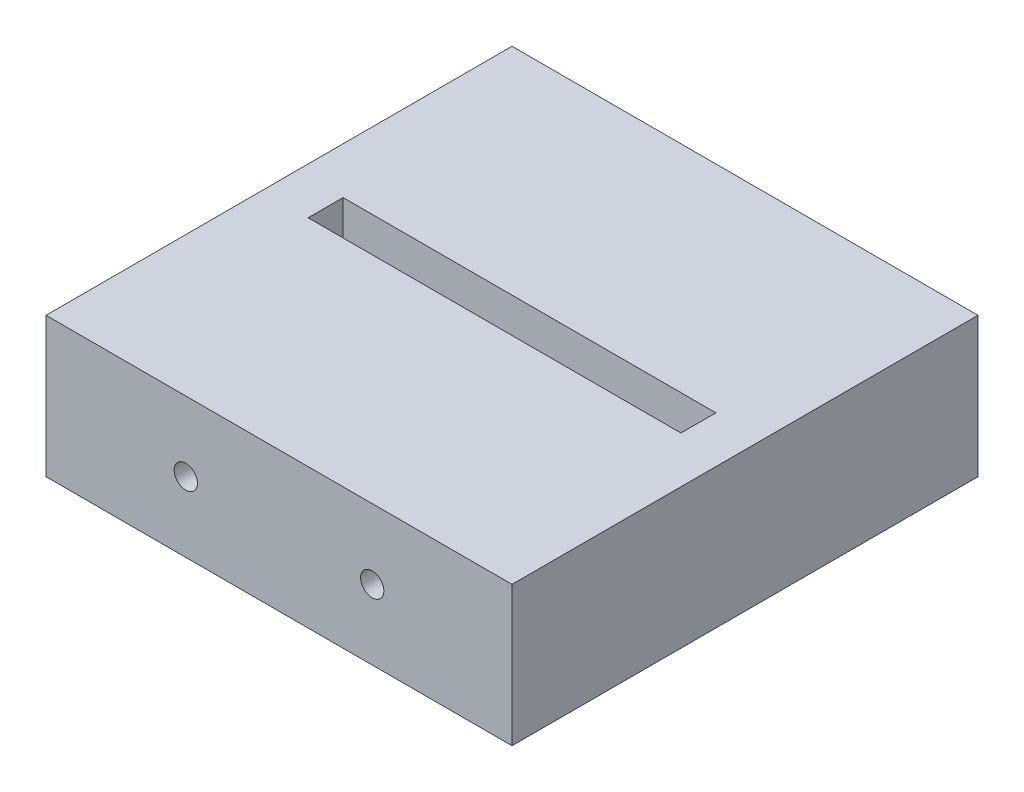
ISO-10303-21;
HEADER;
FILE_DESCRIPTION(('STEP AP214'),'2;1');
FILE_NAME('part.step','',(''),(''),'','','');
FILE_SCHEMA(('AUTOMOTIVE_DESIGN { 1 0 10303 214 1 1 1 1 }'));
ENDSEC;
DATA;
#1=APPLICATION_CONTEXT('core data for automotive mechanical design processes');
#2=APPLICATION_PROTOCOL_DEFINITION('international standard','automotive_design',2000,#1);
#3=PRODUCT_CONTEXT('',#1,'mechanical');
#4=PRODUCT('Part','Part','',(#3));
#5=PRODUCT_RELATED_PRODUCT_CATEGORY('part','',(#4));
#6=PRODUCT_DEFINITION_FORMATION('','',#4);
#7=PRODUCT_DEFINITION_CONTEXT('part definition',#1,'design');
#8=PRODUCT_DEFINITION('design','',#6,#7);
#9=PRODUCT_DEFINITION_SHAPE('','',#8);
#10=(LENGTH_UNIT() NAMED_UNIT(*) SI_UNIT(.MILLI.,.METRE.));
#11=(NAMED_UNIT(*) PLANE_ANGLE_UNIT() SI_UNIT($,.RADIAN.));
#12=(NAMED_UNIT(*) SI_UNIT($,.STERADIAN.) SOLID_ANGLE_UNIT());
#13=UNCERTAINTY_MEASURE_WITH_UNIT(LENGTH_MEASURE(1.E-05),#10,'distance_accuracy_value','');
#14=(GEOMETRIC_REPRESENTATION_CONTEXT(3) GLOBAL_UNCERTAINTY_ASSIGNED_CONTEXT((#13)) GLOBAL_UNIT_ASSIGNED_CONTEXT((#10,
#11,#12)) REPRESENTATION_CONTEXT('',''));
#15=CARTESIAN_POINT('',(0.,0.,0.));
#16=DIRECTION('',(0.,0.,1.));
#17=DIRECTION('',(1.,0.,0.));
#18=AXIS2_PLACEMENT_3D('',#15,#16,#17);
#19=CARTESIAN_POINT('',(63.5,38.1,63.5));
#20=DIRECTION('',(0.,0.,-1.));
#21=DIRECTION('',(-1.,0.,0.));
#22=AXIS2_PLACEMENT_3D('',#19,#20,#21);
#23=PLANE('',#22);
#24=DIRECTION('',(1.,0.,0.));
#25=VECTOR('',#24,1.);
#26=CARTESIAN_POINT('',(63.5,0.,63.5));
#27=LINE('',#26,#25);
#28=CARTESIAN_POINT('',(-63.5,0.,63.5));
#29=VERTEX_POINT('',#28);
#30=CARTESIAN_POINT('',(63.5,0.,63.5));
#31=VERTEX_POINT('',#30);
#32=EDGE_CURVE('E154',#29,#31,#27,.T.);
#33=ORIENTED_EDGE('',*,*,#32,.T.);
#34=DIRECTION('',(0.,-1.,0.));
#35=VECTOR('',#34,1.);
#36=CARTESIAN_POINT('',(63.5,38.1,63.5));
#37=LINE('',#36,#35);
#38=CARTESIAN_POINT('',(63.5,38.1,63.5));
#39=VERTEX_POINT('',#38);
#40=EDGE_CURVE('E42',#39,#31,#37,.T.);
#41=ORIENTED_EDGE('',*,*,#40,.F.);
#42=DIRECTION('',(1.,0.,0.));
#43=VECTOR('',#42,1.);
#44=CARTESIAN_POINT('',(63.5,38.1,63.5));
#45=LINE('',#44,#43);
#46=CARTESIAN_POINT('',(-63.5,38.1,63.5));
#47=VERTEX_POINT('',#46);
#48=EDGE_CURVE('E144',#47,#39,#45,.T.);
#49=ORIENTED_EDGE('',*,*,#48,.F.);
#50=DIRECTION('',(0.,-1.,0.));
#51=VECTOR('',#50,1.);
#52=CARTESIAN_POINT('',(-63.5,38.1,63.5));
#53=LINE('',#52,#51);
#54=EDGE_CURVE('E11',#47,#29,#53,.T.);
#55=ORIENTED_EDGE('',*,*,#54,.T.);
#56=EDGE_LOOP('',(#33,#41,#49,#55));
#57=FACE_BOUND('',#56,.T.);
#58=CARTESIAN_POINT('',(-25.4,19.05,63.5));
#59=DIRECTION('',(0.,0.,1.));
#60=DIRECTION('',(1.,0.,0.));
#61=AXIS2_PLACEMENT_3D('',#58,#59,#60);
#62=CIRCLE('',#61,3.175);
#63=CARTESIAN_POINT('',(-22.225,19.05,63.5));
#64=VERTEX_POINT('',#63);
#65=EDGE_CURVE('E171',#64,#64,#62,.T.);
#66=ORIENTED_EDGE('',*,*,#65,.F.);
#67=EDGE_LOOP('',(#66));
#68=FACE_BOUND('',#67,.T.);
#69=CARTESIAN_POINT('',(25.4,19.05,63.5));
#70=DIRECTION('',(0.,0.,-1.));
#71=DIRECTION('',(-1.,0.,0.));
#72=AXIS2_PLACEMENT_3D('',#69,#70,#71);
#73=CIRCLE('',#72,3.175);
#74=CARTESIAN_POINT('',(22.225,19.05,63.5));
#75=VERTEX_POINT('',#74);
#76=EDGE_CURVE('E183',#75,#75,#73,.T.);
#77=ORIENTED_EDGE('',*,*,#76,.T.);
#78=EDGE_LOOP('',(#77));
#79=FACE_BOUND('',#78,.T.);
#80=ADVANCED_FACE('F33',(#57,#68,#79),#23,.F.);
#81=CARTESIAN_POINT('',(63.5,38.1,-63.5));
#82=DIRECTION('',(0.,0.,1.));
#83=DIRECTION('',(1.,0.,0.));
#84=AXIS2_PLACEMENT_3D('',#81,#82,#83);
#85=PLANE('',#84);
#86=DIRECTION('',(-1.,0.,0.));
#87=VECTOR('',#86,1.);
#88=CARTESIAN_POINT('',(63.5,0.,-63.5));
#89=LINE('',#88,#87);
#90=CARTESIAN_POINT('',(63.5,0.,-63.5));
#91=VERTEX_POINT('',#90);
#92=CARTESIAN_POINT('',(-63.5,0.,-63.5));
#93=VERTEX_POINT('',#92);
#94=EDGE_CURVE('E145',#91,#93,#89,.T.);
#95=ORIENTED_EDGE('',*,*,#94,.T.);
#96=DIRECTION('',(0.,-1.,0.));
#97=VECTOR('',#96,1.);
#98=CARTESIAN_POINT('',(-63.5,38.1,-63.5));
#99=LINE('',#98,#97);
#100=CARTESIAN_POINT('',(-63.5,38.1,-63.5));
#101=VERTEX_POINT('',#100);
#102=EDGE_CURVE('E151',#101,#93,#99,.T.);
#103=ORIENTED_EDGE('',*,*,#102,.F.);
#104=DIRECTION('',(-1.,0.,0.));
#105=VECTOR('',#104,1.);
#106=CARTESIAN_POINT('',(63.5,38.1,-63.5));
#107=LINE('',#106,#105);
#108=CARTESIAN_POINT('',(63.5,38.1,-63.5));
#109=VERTEX_POINT('',#108);
#110=EDGE_CURVE('E149',#109,#101,#107,.T.);
#111=ORIENTED_EDGE('',*,*,#110,.F.);
#112=DIRECTION('',(0.,-1.,0.));
#113=VECTOR('',#112,1.);
#114=CARTESIAN_POINT('',(63.5,38.1,-63.5));
#115=LINE('',#114,#113);
#116=EDGE_CURVE('E161',#109,#91,#115,.T.);
#117=ORIENTED_EDGE('',*,*,#116,.T.);
#118=EDGE_LOOP('',(#95,#103,#111,#117));
#119=FACE_BOUND('',#118,.T.);
#120=CARTESIAN_POINT('',(-25.4,19.05,-63.5));
#121=DIRECTION('',(0.,0.,1.));
#122=DIRECTION('',(1.,0.,0.));
#123=AXIS2_PLACEMENT_3D('',#120,#121,#122);
#124=CIRCLE('',#123,3.175);
#125=CARTESIAN_POINT('',(-22.225,19.05,-63.5));
#126=VERTEX_POINT('',#125);
#127=EDGE_CURVE('E167',#126,#126,#124,.T.);
#128=ORIENTED_EDGE('',*,*,#127,.T.);
#129=EDGE_LOOP('',(#128));
#130=FACE_BOUND('',#129,.T.);
#131=CARTESIAN_POINT('',(25.4,19.05,-63.5));
#132=DIRECTION('',(0.,0.,-1.));
#133=DIRECTION('',(-1.,0.,0.));
#134=AXIS2_PLACEMENT_3D('',#131,#132,#133);
#135=CIRCLE('',#134,3.175);
#136=CARTESIAN_POINT('',(22.225,19.05,-63.5));
#137=VERTEX_POINT('',#136);
#138=EDGE_CURVE('E180',#137,#137,#135,.T.);
#139=ORIENTED_EDGE('',*,*,#138,.F.);
#140=EDGE_LOOP('',(#139));
#141=FACE_BOUND('',#140,.T.);
#142=ADVANCED_FACE('F201',(#119,#130,#141),#85,.F.);
#143=CARTESIAN_POINT('',(50.8,38.1,4.7625));
#144=DIRECTION('',(0.,0.,1.));
#145=DIRECTION('',(1.,0.,0.));
#146=AXIS2_PLACEMENT_3D('',#143,#144,#145);
#147=PLANE('',#146);
#148=DIRECTION('',(-1.,0.,0.));
#149=VECTOR('',#148,1.);
#150=CARTESIAN_POINT('',(50.8,0.,4.7625));
#151=LINE('',#150,#149);
#152=CARTESIAN_POINT('',(50.8,0.,4.7625));
#153=VERTEX_POINT('',#152);
#154=CARTESIAN_POINT('',(-50.8,0.,4.7625));
#155=VERTEX_POINT('',#154);
#156=EDGE_CURVE('E119',#153,#155,#151,.T.);
#157=ORIENTED_EDGE('',*,*,#156,.T.);
#158=DIRECTION('',(0.,-1.,0.));
#159=VECTOR('',#158,1.);
#160=CARTESIAN_POINT('',(-50.8,38.1,4.7625));
#161=LINE('',#160,#159);
#162=CARTESIAN_POINT('',(-50.8,38.1,4.7625));
#163=VERTEX_POINT('',#162);
#164=EDGE_CURVE('E135',#163,#155,#161,.T.);
#165=ORIENTED_EDGE('',*,*,#164,.F.);
#166=DIRECTION('',(-1.,0.,0.));
#167=VECTOR('',#166,1.);
#168=CARTESIAN_POINT('',(50.8,38.1,4.7625));
#169=LINE('',#168,#167);
#170=CARTESIAN_POINT('',(50.8,38.1,4.7625));
#171=VERTEX_POINT('',#170);
#172=EDGE_CURVE('E108',#171,#163,#169,.T.);
#173=ORIENTED_EDGE('',*,*,#172,.F.);
#174=DIRECTION('',(0.,-1.,0.));
#175=VECTOR('',#174,1.);
#176=CARTESIAN_POINT('',(50.8,38.1,4.7625));
#177=LINE('',#176,#175);
#178=EDGE_CURVE('E138',#171,#153,#177,.T.);
#179=ORIENTED_EDGE('',*,*,#178,.T.);
#180=EDGE_LOOP('',(#157,#165,#173,#179));
#181=FACE_BOUND('',#180,.T.);
#182=CARTESIAN_POINT('',(-25.4,19.05,4.7625));
#183=DIRECTION('',(0.,0.,1.));
#184=DIRECTION('',(1.,0.,0.));
#185=AXIS2_PLACEMENT_3D('',#182,#183,#184);
#186=CIRCLE('',#185,3.175);
#187=CARTESIAN_POINT('',(-22.225,19.05,4.7625));
#188=VERTEX_POINT('',#187);
#189=EDGE_CURVE('E125',#188,#188,#186,.T.);
#190=ORIENTED_EDGE('',*,*,#189,.T.);
#191=EDGE_LOOP('',(#190));
#192=FACE_BOUND('',#191,.T.);
#193=CARTESIAN_POINT('',(25.4,19.05,4.7625));
#194=DIRECTION('',(0.,0.,1.));
#195=DIRECTION('',(1.,0.,0.));
#196=AXIS2_PLACEMENT_3D('',#193,#194,#195);
#197=CIRCLE('',#196,3.175);
#198=CARTESIAN_POINT('',(28.575,19.05,4.7625));
#199=VERTEX_POINT('',#198);
#200=EDGE_CURVE('E176',#199,#199,#197,.F.);
#201=ORIENTED_EDGE('',*,*,#200,.F.);
#202=EDGE_LOOP('',(#201));
#203=FACE_BOUND('',#202,.T.);
#204=ADVANCED_FACE('F193',(#181,#192,#203),#147,.F.);
#205=CARTESIAN_POINT('',(50.8,38.1,-4.7625));
#206=DIRECTION('',(0.,0.,-1.));
#207=DIRECTION('',(-1.,0.,0.));
#208=AXIS2_PLACEMENT_3D('',#205,#206,#207);
#209=PLANE('',#208);
#210=DIRECTION('',(1.,0.,0.));
#211=VECTOR('',#210,1.);
#212=CARTESIAN_POINT('',(50.8,0.,-4.7625));
#213=LINE('',#212,#211);
#214=CARTESIAN_POINT('',(-50.8,0.,-4.7625));
#215=VERTEX_POINT('',#214);
#216=CARTESIAN_POINT('',(50.8,0.,-4.7625));
#217=VERTEX_POINT('',#216);
#218=EDGE_CURVE('E131',#215,#217,#213,.T.);
#219=ORIENTED_EDGE('',*,*,#218,.T.);
#220=DIRECTION('',(0.,-1.,0.));
#221=VECTOR('',#220,1.);
#222=CARTESIAN_POINT('',(50.8,38.1,-4.7625));
#223=LINE('',#222,#221);
#224=CARTESIAN_POINT('',(50.8,38.1,-4.7625));
#225=VERTEX_POINT('',#224);
#226=EDGE_CURVE('E107',#225,#217,#223,.T.);
#227=ORIENTED_EDGE('',*,*,#226,.F.);
#228=DIRECTION('',(1.,0.,0.));
#229=VECTOR('',#228,1.);
#230=CARTESIAN_POINT('',(50.8,38.1,-4.7625));
#231=LINE('',#230,#229);
#232=CARTESIAN_POINT('',(-50.8,38.1,-4.7625));
#233=VERTEX_POINT('',#232);
#234=EDGE_CURVE('E111',#233,#225,#231,.T.);
#235=ORIENTED_EDGE('',*,*,#234,.F.);
#236=DIRECTION('',(0.,-1.,0.));
#237=VECTOR('',#236,1.);
#238=CARTESIAN_POINT('',(-50.8,38.1,-4.7625));
#239=LINE('',#238,#237);
#240=EDGE_CURVE('E98',#233,#215,#239,.T.);
#241=ORIENTED_EDGE('',*,*,#240,.T.);
#242=EDGE_LOOP('',(#219,#227,#235,#241));
#243=FACE_BOUND('',#242,.T.);
#244=CARTESIAN_POINT('',(-25.4,19.05,-4.7625));
#245=DIRECTION('',(0.,0.,-1.));
#246=DIRECTION('',(-1.,0.,0.));
#247=AXIS2_PLACEMENT_3D('',#244,#245,#246);
#248=CIRCLE('',#247,3.175);
#249=CARTESIAN_POINT('',(-28.575,19.05,-4.7625));
#250=VERTEX_POINT('',#249);
#251=EDGE_CURVE('E165',#250,#250,#248,.T.);
#252=ORIENTED_EDGE('',*,*,#251,.T.);
#253=EDGE_LOOP('',(#252));
#254=FACE_BOUND('',#253,.T.);
#255=CARTESIAN_POINT('',(25.4,19.05,-4.7625));
#256=DIRECTION('',(0.,0.,-1.));
#257=DIRECTION('',(-1.,0.,0.));
#258=AXIS2_PLACEMENT_3D('',#255,#256,#257);
#259=CIRCLE('',#258,3.175);
#260=CARTESIAN_POINT('',(22.225,19.05,-4.7625));
#261=VERTEX_POINT('',#260);
#262=EDGE_CURVE('E37',#261,#261,#259,.F.);
#263=ORIENTED_EDGE('',*,*,#262,.F.);
#264=EDGE_LOOP('',(#263));
#265=FACE_BOUND('',#264,.T.);
#266=ADVANCED_FACE('F112',(#243,#254,#265),#209,.F.);
#267=CARTESIAN_POINT('',(-63.5,38.1,63.5));
#268=DIRECTION('',(1.,0.,0.));
#269=DIRECTION('',(0.,0.,-1.));
#270=AXIS2_PLACEMENT_3D('',#267,#268,#269);
#271=PLANE('',#270);
#272=DIRECTION('',(0.,0.,1.));
#273=VECTOR('',#272,1.);
#274=CARTESIAN_POINT('',(-63.5,0.,63.5));
#275=LINE('',#274,#273);
#276=EDGE_CURVE('E137',#93,#29,#275,.T.);
#277=ORIENTED_EDGE('',*,*,#276,.T.);
#278=ORIENTED_EDGE('',*,*,#54,.F.);
#279=DIRECTION('',(0.,0.,1.));
#280=VECTOR('',#279,1.);
#281=CARTESIAN_POINT('',(-63.5,38.1,63.5));
#282=LINE('',#281,#280);
#283=EDGE_CURVE('E141',#101,#47,#282,.T.);
#284=ORIENTED_EDGE('',*,*,#283,.F.);
#285=ORIENTED_EDGE('',*,*,#102,.T.);
#286=EDGE_LOOP('',(#277,#278,#284,#285));
#287=FACE_BOUND('',#286,.T.);
#288=ADVANCED_FACE('F35',(#287),#271,.F.);
#289=CARTESIAN_POINT('',(63.5,38.1,63.5));
#290=DIRECTION('',(-1.,0.,0.));
#291=DIRECTION('',(0.,0.,1.));
#292=AXIS2_PLACEMENT_3D('',#289,#290,#291);
#293=PLANE('',#292);
#294=DIRECTION('',(0.,0.,-1.));
#295=VECTOR('',#294,1.);
#296=CARTESIAN_POINT('',(63.5,0.,63.5));
#297=LINE('',#296,#295);
#298=EDGE_CURVE('E156',#31,#91,#297,.T.);
#299=ORIENTED_EDGE('',*,*,#298,.T.);
#300=ORIENTED_EDGE('',*,*,#116,.F.);
#301=DIRECTION('',(0.,0.,-1.));
#302=VECTOR('',#301,1.);
#303=CARTESIAN_POINT('',(63.5,38.1,63.5));
#304=LINE('',#303,#302);
#305=EDGE_CURVE('E147',#39,#109,#304,.T.);
#306=ORIENTED_EDGE('',*,*,#305,.F.);
#307=ORIENTED_EDGE('',*,*,#40,.T.);
#308=EDGE_LOOP('',(#299,#300,#306,#307));
#309=FACE_BOUND('',#308,.T.);
#310=ADVANCED_FACE('F199',(#309),#293,.F.);
#311=CARTESIAN_POINT('',(0.,38.1,0.));
#312=DIRECTION('',(0.,1.,0.));
#313=DIRECTION('',(0.,0.,1.));
#314=AXIS2_PLACEMENT_3D('',#311,#312,#313);
#315=PLANE('',#314);
#316=DIRECTION('',(0.,0.,-1.));
#317=VECTOR('',#316,1.);
#318=CARTESIAN_POINT('',(-50.8,38.1,4.7625));
#319=LINE('',#318,#317);
#320=EDGE_CURVE('E102',#163,#233,#319,.T.);
#321=ORIENTED_EDGE('',*,*,#320,.T.);
#322=ORIENTED_EDGE('',*,*,#234,.T.);
#323=DIRECTION('',(0.,0.,1.));
#324=VECTOR('',#323,1.);
#325=CARTESIAN_POINT('',(50.8,38.1,4.7625));
#326=LINE('',#325,#324);
#327=EDGE_CURVE('E50',#225,#171,#326,.T.);
#328=ORIENTED_EDGE('',*,*,#327,.T.);
#329=ORIENTED_EDGE('',*,*,#172,.T.);
#330=EDGE_LOOP('',(#321,#322,#328,#329));
#331=FACE_BOUND('',#330,.T.);
#332=ORIENTED_EDGE('',*,*,#283,.T.);
#333=ORIENTED_EDGE('',*,*,#48,.T.);
#334=ORIENTED_EDGE('',*,*,#305,.T.);
#335=ORIENTED_EDGE('',*,*,#110,.T.);
#336=EDGE_LOOP('',(#332,#333,#334,#335));
#337=FACE_BOUND('',#336,.T.);
#338=ADVANCED_FACE('F116',(#331,#337),#315,.T.);
#339=CARTESIAN_POINT('',(0.,0.,0.));
#340=DIRECTION('',(0.,1.,0.));
#341=DIRECTION('',(0.,0.,1.));
#342=AXIS2_PLACEMENT_3D('',#339,#340,#341);
#343=PLANE('',#342);
#344=ORIENTED_EDGE('',*,*,#218,.F.);
#345=DIRECTION('',(0.,0.,-1.));
#346=VECTOR('',#345,1.);
#347=CARTESIAN_POINT('',(-50.8,0.,4.7625));
#348=LINE('',#347,#346);
#349=EDGE_CURVE('E58',#155,#215,#348,.T.);
#350=ORIENTED_EDGE('',*,*,#349,.F.);
#351=ORIENTED_EDGE('',*,*,#156,.F.);
#352=DIRECTION('',(0.,0.,1.));
#353=VECTOR('',#352,1.);
#354=CARTESIAN_POINT('',(50.8,0.,4.7625));
#355=LINE('',#354,#353);
#356=EDGE_CURVE('E122',#217,#153,#355,.T.);
#357=ORIENTED_EDGE('',*,*,#356,.F.);
#358=EDGE_LOOP('',(#344,#350,#351,#357));
#359=FACE_BOUND('',#358,.T.);
#360=ORIENTED_EDGE('',*,*,#276,.F.);
#361=ORIENTED_EDGE('',*,*,#94,.F.);
#362=ORIENTED_EDGE('',*,*,#298,.F.);
#363=ORIENTED_EDGE('',*,*,#32,.F.);
#364=EDGE_LOOP('',(#360,#361,#362,#363));
#365=FACE_BOUND('',#364,.T.);
#366=ADVANCED_FACE('F218',(#359,#365),#343,.F.);
#367=CARTESIAN_POINT('',(-50.8,38.1,4.7625));
#368=DIRECTION('',(-1.,0.,0.));
#369=DIRECTION('',(0.,0.,1.));
#370=AXIS2_PLACEMENT_3D('',#367,#368,#369);
#371=PLANE('',#370);
#372=ORIENTED_EDGE('',*,*,#349,.T.);
#373=ORIENTED_EDGE('',*,*,#240,.F.);
#374=ORIENTED_EDGE('',*,*,#320,.F.);
#375=ORIENTED_EDGE('',*,*,#164,.T.);
#376=EDGE_LOOP('',(#372,#373,#374,#375));
#377=FACE_BOUND('',#376,.T.);
#378=ADVANCED_FACE('F100',(#377),#371,.F.);
#379=CARTESIAN_POINT('',(50.8,38.1,4.7625));
#380=DIRECTION('',(1.,0.,0.));
#381=DIRECTION('',(0.,0.,-1.));
#382=AXIS2_PLACEMENT_3D('',#379,#380,#381);
#383=PLANE('',#382);
#384=ORIENTED_EDGE('',*,*,#356,.T.);
#385=ORIENTED_EDGE('',*,*,#178,.F.);
#386=ORIENTED_EDGE('',*,*,#327,.F.);
#387=ORIENTED_EDGE('',*,*,#226,.T.);
#388=EDGE_LOOP('',(#384,#385,#386,#387));
#389=FACE_BOUND('',#388,.T.);
#390=ADVANCED_FACE('F224',(#389),#383,.F.);
#391=CARTESIAN_POINT('',(-25.4,19.05,-63.5));
#392=DIRECTION('',(0.,0.,1.));
#393=DIRECTION('',(1.,0.,0.));
#394=AXIS2_PLACEMENT_3D('',#391,#392,#393);
#395=CYLINDRICAL_SURFACE('',#394,3.175);
#396=ORIENTED_EDGE('',*,*,#127,.F.);
#397=EDGE_LOOP('',(#396));
#398=FACE_BOUND('',#397,.T.);
#399=ORIENTED_EDGE('',*,*,#251,.F.);
#400=EDGE_LOOP('',(#399));
#401=FACE_BOUND('',#400,.T.);
#402=ADVANCED_FACE('F228',(#398,#401),#395,.F.);
#403=ORIENTED_EDGE('',*,*,#65,.T.);
#404=EDGE_LOOP('',(#403));
#405=FACE_BOUND('',#404,.T.);
#406=ORIENTED_EDGE('',*,*,#189,.F.);
#407=EDGE_LOOP('',(#406));
#408=FACE_BOUND('',#407,.T.);
#409=ADVANCED_FACE('F232',(#405,#408),#395,.F.);
#410=CARTESIAN_POINT('',(25.4,19.05,-63.5));
#411=DIRECTION('',(0.,0.,1.));
#412=DIRECTION('',(1.,0.,0.));
#413=AXIS2_PLACEMENT_3D('',#410,#411,#412);
#414=CYLINDRICAL_SURFACE('',#413,3.175);
#415=ORIENTED_EDGE('',*,*,#138,.T.);
#416=EDGE_LOOP('',(#415));
#417=FACE_BOUND('',#416,.T.);
#418=ORIENTED_EDGE('',*,*,#262,.T.);
#419=EDGE_LOOP('',(#418));
#420=FACE_BOUND('',#419,.T.);
#421=ADVANCED_FACE('F190',(#417,#420),#414,.F.);
#422=ORIENTED_EDGE('',*,*,#76,.F.);
#423=EDGE_LOOP('',(#422));
#424=FACE_BOUND('',#423,.T.);
#425=ORIENTED_EDGE('',*,*,#200,.T.);
#426=EDGE_LOOP('',(#425));
#427=FACE_BOUND('',#426,.T.);
#428=ADVANCED_FACE('F238',(#424,#427),#414,.F.);
#429=CLOSED_SHELL('',(#80,#142,#204,#266,#288,#310,#338,#366,#378,#390,#402,#409,#421,#428));
#430=MANIFOLD_SOLID_BREP('B2',#429);
#431=ADVANCED_BREP_SHAPE_REPRESENTATION('',(#18,#430),#14);
#432=SHAPE_DEFINITION_REPRESENTATION(#9,#431);
ENDSEC;
END-ISO-10303-21;
